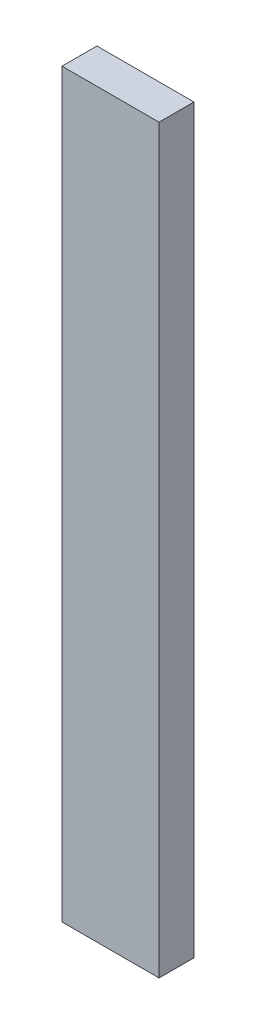
ISO-10303-21;
HEADER;
FILE_DESCRIPTION(('STEP AP214'),'2;1');
FILE_NAME('part.step','',(''),(''),'','','');
FILE_SCHEMA(('AUTOMOTIVE_DESIGN { 1 0 10303 214 1 1 1 1 }'));
ENDSEC;
DATA;
#1=APPLICATION_CONTEXT('core data for automotive mechanical design processes');
#2=APPLICATION_PROTOCOL_DEFINITION('international standard','automotive_design',2000,#1);
#3=PRODUCT_CONTEXT('',#1,'mechanical');
#4=PRODUCT('Part','Part','',(#3));
#5=PRODUCT_RELATED_PRODUCT_CATEGORY('part','',(#4));
#6=PRODUCT_DEFINITION_FORMATION('','',#4);
#7=PRODUCT_DEFINITION_CONTEXT('part definition',#1,'design');
#8=PRODUCT_DEFINITION('design','',#6,#7);
#9=PRODUCT_DEFINITION_SHAPE('','',#8);
#10=(LENGTH_UNIT() NAMED_UNIT(*) SI_UNIT(.MILLI.,.METRE.));
#11=(NAMED_UNIT(*) PLANE_ANGLE_UNIT() SI_UNIT($,.RADIAN.));
#12=(NAMED_UNIT(*) SI_UNIT($,.STERADIAN.) SOLID_ANGLE_UNIT());
#13=UNCERTAINTY_MEASURE_WITH_UNIT(LENGTH_MEASURE(1.E-05),#10,'distance_accuracy_value','');
#14=(GEOMETRIC_REPRESENTATION_CONTEXT(3) GLOBAL_UNCERTAINTY_ASSIGNED_CONTEXT((#13)) GLOBAL_UNIT_ASSIGNED_CONTEXT((#10,
#11,#12)) REPRESENTATION_CONTEXT('',''));
#15=CARTESIAN_POINT('',(0.,0.,0.));
#16=DIRECTION('',(0.,0.,1.));
#17=DIRECTION('',(1.,0.,0.));
#18=AXIS2_PLACEMENT_3D('',#15,#16,#17);
#19=CARTESIAN_POINT('',(-25.,191.,18.));
#20=DIRECTION('',(1.,0.,0.));
#21=DIRECTION('',(0.,1.,0.));
#22=AXIS2_PLACEMENT_3D('',#19,#20,#21);
#23=PLANE('',#22);
#24=DIRECTION('',(0.,-1.,0.));
#25=VECTOR('',#24,1.);
#26=CARTESIAN_POINT('',(-25.,191.,0.));
#27=LINE('',#26,#25);
#28=CARTESIAN_POINT('',(-25.,191.,0.));
#29=VERTEX_POINT('',#28);
#30=CARTESIAN_POINT('',(-25.,-191.,0.));
#31=VERTEX_POINT('',#30);
#32=EDGE_CURVE('E96',#29,#31,#27,.T.);
#33=ORIENTED_EDGE('',*,*,#32,.T.);
#34=DIRECTION('',(0.,0.,-1.));
#35=VECTOR('',#34,1.);
#36=CARTESIAN_POINT('',(-25.,-191.,18.));
#37=LINE('',#36,#35);
#38=CARTESIAN_POINT('',(-25.,-191.,18.));
#39=VERTEX_POINT('',#38);
#40=EDGE_CURVE('E11',#39,#31,#37,.T.);
#41=ORIENTED_EDGE('',*,*,#40,.F.);
#42=DIRECTION('',(0.,-1.,0.));
#43=VECTOR('',#42,1.);
#44=CARTESIAN_POINT('',(-25.,191.,18.));
#45=LINE('',#44,#43);
#46=CARTESIAN_POINT('',(-25.,191.,18.));
#47=VERTEX_POINT('',#46);
#48=EDGE_CURVE('E84',#47,#39,#45,.T.);
#49=ORIENTED_EDGE('',*,*,#48,.F.);
#50=DIRECTION('',(0.,0.,-1.));
#51=VECTOR('',#50,1.);
#52=CARTESIAN_POINT('',(-25.,191.,18.));
#53=LINE('',#52,#51);
#54=EDGE_CURVE('E92',#47,#29,#53,.T.);
#55=ORIENTED_EDGE('',*,*,#54,.T.);
#56=EDGE_LOOP('',(#33,#41,#49,#55));
#57=FACE_BOUND('',#56,.T.);
#58=ADVANCED_FACE('F33',(#57),#23,.F.);
#59=CARTESIAN_POINT('',(25.,-191.,18.));
#60=DIRECTION('',(0.,1.,0.));
#61=DIRECTION('',(0.,0.,1.));
#62=AXIS2_PLACEMENT_3D('',#59,#60,#61);
#63=PLANE('',#62);
#64=DIRECTION('',(1.,0.,0.));
#65=VECTOR('',#64,1.);
#66=CARTESIAN_POINT('',(25.,-191.,0.));
#67=LINE('',#66,#65);
#68=CARTESIAN_POINT('',(25.,-191.,0.));
#69=VERTEX_POINT('',#68);
#70=EDGE_CURVE('E88',#31,#69,#67,.T.);
#71=ORIENTED_EDGE('',*,*,#70,.T.);
#72=DIRECTION('',(0.,0.,-1.));
#73=VECTOR('',#72,1.);
#74=CARTESIAN_POINT('',(25.,-191.,18.));
#75=LINE('',#74,#73);
#76=CARTESIAN_POINT('',(25.,-191.,18.));
#77=VERTEX_POINT('',#76);
#78=EDGE_CURVE('E41',#77,#69,#75,.T.);
#79=ORIENTED_EDGE('',*,*,#78,.F.);
#80=DIRECTION('',(1.,0.,0.));
#81=VECTOR('',#80,1.);
#82=CARTESIAN_POINT('',(25.,-191.,18.));
#83=LINE('',#82,#81);
#84=EDGE_CURVE('E79',#39,#77,#83,.T.);
#85=ORIENTED_EDGE('',*,*,#84,.F.);
#86=ORIENTED_EDGE('',*,*,#40,.T.);
#87=EDGE_LOOP('',(#71,#79,#85,#86));
#88=FACE_BOUND('',#87,.T.);
#89=ADVANCED_FACE('F87',(#88),#63,.F.);
#90=CARTESIAN_POINT('',(25.,191.,18.));
#91=DIRECTION('',(-1.,0.,0.));
#92=DIRECTION('',(0.,-1.,0.));
#93=AXIS2_PLACEMENT_3D('',#90,#91,#92);
#94=PLANE('',#93);
#95=DIRECTION('',(0.,1.,0.));
#96=VECTOR('',#95,1.);
#97=CARTESIAN_POINT('',(25.,191.,0.));
#98=LINE('',#97,#96);
#99=CARTESIAN_POINT('',(25.,191.,0.));
#100=VERTEX_POINT('',#99);
#101=EDGE_CURVE('E66',#69,#100,#98,.T.);
#102=ORIENTED_EDGE('',*,*,#101,.T.);
#103=DIRECTION('',(0.,0.,-1.));
#104=VECTOR('',#103,1.);
#105=CARTESIAN_POINT('',(25.,191.,18.));
#106=LINE('',#105,#104);
#107=CARTESIAN_POINT('',(25.,191.,18.));
#108=VERTEX_POINT('',#107);
#109=EDGE_CURVE('E89',#108,#100,#106,.T.);
#110=ORIENTED_EDGE('',*,*,#109,.F.);
#111=DIRECTION('',(0.,1.,0.));
#112=VECTOR('',#111,1.);
#113=CARTESIAN_POINT('',(25.,191.,18.));
#114=LINE('',#113,#112);
#115=EDGE_CURVE('E82',#77,#108,#114,.T.);
#116=ORIENTED_EDGE('',*,*,#115,.F.);
#117=ORIENTED_EDGE('',*,*,#78,.T.);
#118=EDGE_LOOP('',(#102,#110,#116,#117));
#119=FACE_BOUND('',#118,.T.);
#120=ADVANCED_FACE('F90',(#119),#94,.F.);
#121=CARTESIAN_POINT('',(25.,191.,18.));
#122=DIRECTION('',(0.,-1.,0.));
#123=DIRECTION('',(1.,0.,0.));
#124=AXIS2_PLACEMENT_3D('',#121,#122,#123);
#125=PLANE('',#124);
#126=DIRECTION('',(-1.,0.,0.));
#127=VECTOR('',#126,1.);
#128=CARTESIAN_POINT('',(25.,191.,0.));
#129=LINE('',#128,#127);
#130=EDGE_CURVE('E72',#100,#29,#129,.T.);
#131=ORIENTED_EDGE('',*,*,#130,.T.);
#132=ORIENTED_EDGE('',*,*,#54,.F.);
#133=DIRECTION('',(-1.,0.,0.));
#134=VECTOR('',#133,1.);
#135=CARTESIAN_POINT('',(25.,191.,18.));
#136=LINE('',#135,#134);
#137=EDGE_CURVE('E49',#108,#47,#136,.T.);
#138=ORIENTED_EDGE('',*,*,#137,.F.);
#139=ORIENTED_EDGE('',*,*,#109,.T.);
#140=EDGE_LOOP('',(#131,#132,#138,#139));
#141=FACE_BOUND('',#140,.T.);
#142=ADVANCED_FACE('F103',(#141),#125,.F.);
#143=CARTESIAN_POINT('',(0.,0.,18.));
#144=DIRECTION('',(0.,0.,-1.));
#145=DIRECTION('',(-1.,0.,0.));
#146=AXIS2_PLACEMENT_3D('',#143,#144,#145);
#147=PLANE('',#146);
#148=ORIENTED_EDGE('',*,*,#48,.T.);
#149=ORIENTED_EDGE('',*,*,#84,.T.);
#150=ORIENTED_EDGE('',*,*,#115,.T.);
#151=ORIENTED_EDGE('',*,*,#137,.T.);
#152=EDGE_LOOP('',(#148,#149,#150,#151));
#153=FACE_BOUND('',#152,.T.);
#154=ADVANCED_FACE('F80',(#153),#147,.F.);
#155=CARTESIAN_POINT('',(0.,0.,0.));
#156=DIRECTION('',(0.,0.,-1.));
#157=DIRECTION('',(-1.,0.,0.));
#158=AXIS2_PLACEMENT_3D('',#155,#156,#157);
#159=PLANE('',#158);
#160=ORIENTED_EDGE('',*,*,#32,.F.);
#161=ORIENTED_EDGE('',*,*,#130,.F.);
#162=ORIENTED_EDGE('',*,*,#101,.F.);
#163=ORIENTED_EDGE('',*,*,#70,.F.);
#164=EDGE_LOOP('',(#160,#161,#162,#163));
#165=FACE_BOUND('',#164,.T.);
#166=ADVANCED_FACE('F106',(#165),#159,.T.);
#167=CLOSED_SHELL('',(#58,#89,#120,#142,#154,#166));
#168=MANIFOLD_SOLID_BREP('B2',#167);
#169=ADVANCED_BREP_SHAPE_REPRESENTATION('',(#18,#168),#14);
#170=SHAPE_DEFINITION_REPRESENTATION(#9,#169);
ENDSEC;
END-ISO-10303-21;
